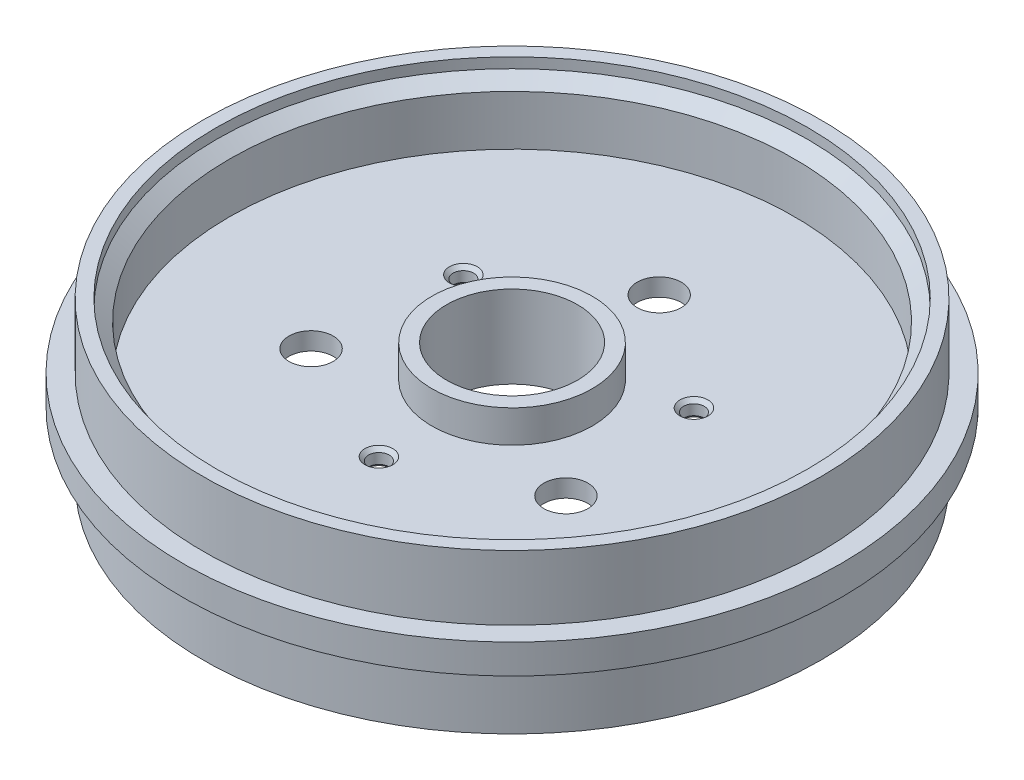
ISO-10303-21;
HEADER;
FILE_DESCRIPTION(('STEP AP214'),'2;1');
FILE_NAME('part.step','',(''),(''),'','','');
FILE_SCHEMA(('AUTOMOTIVE_DESIGN { 1 0 10303 214 1 1 1 1 }'));
ENDSEC;
DATA;
#1=APPLICATION_CONTEXT('core data for automotive mechanical design processes');
#2=APPLICATION_PROTOCOL_DEFINITION('international standard','automotive_design',2000,#1);
#3=PRODUCT_CONTEXT('',#1,'mechanical');
#4=PRODUCT('Part','Part','',(#3));
#5=PRODUCT_RELATED_PRODUCT_CATEGORY('part','',(#4));
#6=PRODUCT_DEFINITION_FORMATION('','',#4);
#7=PRODUCT_DEFINITION_CONTEXT('part definition',#1,'design');
#8=PRODUCT_DEFINITION('design','',#6,#7);
#9=PRODUCT_DEFINITION_SHAPE('','',#8);
#10=(LENGTH_UNIT() NAMED_UNIT(*) SI_UNIT(.MILLI.,.METRE.));
#11=(NAMED_UNIT(*) PLANE_ANGLE_UNIT() SI_UNIT($,.RADIAN.));
#12=(NAMED_UNIT(*) SI_UNIT($,.STERADIAN.) SOLID_ANGLE_UNIT());
#13=UNCERTAINTY_MEASURE_WITH_UNIT(LENGTH_MEASURE(1.E-05),#10,'distance_accuracy_value','');
#14=(GEOMETRIC_REPRESENTATION_CONTEXT(3) GLOBAL_UNCERTAINTY_ASSIGNED_CONTEXT((#13)) GLOBAL_UNIT_ASSIGNED_CONTEXT((#10,
#11,#12)) REPRESENTATION_CONTEXT('',''));
#15=CARTESIAN_POINT('',(0.,0.,0.));
#16=DIRECTION('',(0.,0.,1.));
#17=DIRECTION('',(1.,0.,0.));
#18=AXIS2_PLACEMENT_3D('',#15,#16,#17);
#19=CARTESIAN_POINT('',(0.,-5.4,0.));
#20=DIRECTION('',(0.,-1.,0.));
#21=DIRECTION('',(1.,0.,0.));
#22=AXIS2_PLACEMENT_3D('',#19,#20,#21);
#23=CYLINDRICAL_SURFACE('',#22,4.45);
#24=CARTESIAN_POINT('',(0.,2.8,0.));
#25=DIRECTION('',(0.,-1.,0.));
#26=DIRECTION('',(1.,0.,0.));
#27=AXIS2_PLACEMENT_3D('',#24,#25,#26);
#28=CIRCLE('',#27,4.45);
#29=CARTESIAN_POINT('',(4.45,2.8,0.));
#30=VERTEX_POINT('',#29);
#31=EDGE_CURVE('E10',#30,#30,#28,.T.);
#32=ORIENTED_EDGE('',*,*,#31,.F.);
#33=EDGE_LOOP('',(#32));
#34=FACE_BOUND('',#33,.T.);
#35=CARTESIAN_POINT('',(0.,-2.8,0.));
#36=DIRECTION('',(0.,-1.,0.));
#37=DIRECTION('',(1.,0.,0.));
#38=AXIS2_PLACEMENT_3D('',#35,#36,#37);
#39=CIRCLE('',#38,4.45);
#40=CARTESIAN_POINT('',(4.45,-2.8,0.));
#41=VERTEX_POINT('',#40);
#42=EDGE_CURVE('E125',#41,#41,#39,.T.);
#43=ORIENTED_EDGE('',*,*,#42,.T.);
#44=EDGE_LOOP('',(#43));
#45=FACE_BOUND('',#44,.T.);
#46=ADVANCED_FACE('F34',(#34,#45),#23,.F.);
#47=CARTESIAN_POINT('',(4.45,2.8,0.));
#48=DIRECTION('',(0.,1.,0.));
#49=DIRECTION('',(-1.,0.,0.));
#50=AXIS2_PLACEMENT_3D('',#47,#48,#49);
#51=PLANE('',#50);
#52=ORIENTED_EDGE('',*,*,#31,.T.);
#53=EDGE_LOOP('',(#52));
#54=FACE_BOUND('',#53,.T.);
#55=CARTESIAN_POINT('',(0.,2.8,0.));
#56=DIRECTION('',(0.,-1.,0.));
#57=DIRECTION('',(1.,0.,0.));
#58=AXIS2_PLACEMENT_3D('',#55,#56,#57);
#59=CIRCLE('',#58,5.45);
#60=CARTESIAN_POINT('',(5.45,2.8,0.));
#61=VERTEX_POINT('',#60);
#62=EDGE_CURVE('E41',#61,#61,#59,.T.);
#63=ORIENTED_EDGE('',*,*,#62,.F.);
#64=EDGE_LOOP('',(#63));
#65=FACE_BOUND('',#64,.T.);
#66=ADVANCED_FACE('F156',(#54,#65),#51,.T.);
#67=CARTESIAN_POINT('',(0.,-5.4,0.));
#68=DIRECTION('',(0.,-1.,0.));
#69=DIRECTION('',(1.,0.,0.));
#70=AXIS2_PLACEMENT_3D('',#67,#68,#69);
#71=CYLINDRICAL_SURFACE('',#70,5.45);
#72=ORIENTED_EDGE('',*,*,#62,.T.);
#73=EDGE_LOOP('',(#72));
#74=FACE_BOUND('',#73,.T.);
#75=CARTESIAN_POINT('',(0.,0.6,0.));
#76=DIRECTION('',(0.,-1.,0.));
#77=DIRECTION('',(1.,0.,0.));
#78=AXIS2_PLACEMENT_3D('',#75,#76,#77);
#79=CIRCLE('',#78,5.45);
#80=CARTESIAN_POINT('',(5.45,0.600000000000001,0.));
#81=VERTEX_POINT('',#80);
#82=EDGE_CURVE('E46',#81,#81,#79,.T.);
#83=ORIENTED_EDGE('',*,*,#82,.F.);
#84=EDGE_LOOP('',(#83));
#85=FACE_BOUND('',#84,.T.);
#86=ADVANCED_FACE('F154',(#74,#85),#71,.T.);
#87=CARTESIAN_POINT('',(5.45,0.599999999999999,0.));
#88=DIRECTION('',(0.,1.,0.));
#89=DIRECTION('',(-1.,0.,0.));
#90=AXIS2_PLACEMENT_3D('',#87,#88,#89);
#91=PLANE('',#90);
#92=CARTESIAN_POINT('',(0.,0.599999999999998,9.05));
#93=DIRECTION('',(0.,1.,0.));
#94=DIRECTION('',(-1.,0.,0.));
#95=AXIS2_PLACEMENT_3D('',#92,#93,#94);
#96=CIRCLE('',#95,0.95);
#97=CARTESIAN_POINT('',(-0.95,0.599999999999998,9.05));
#98=VERTEX_POINT('',#97);
#99=EDGE_CURVE('E54',#98,#98,#96,.T.);
#100=ORIENTED_EDGE('',*,*,#99,.F.);
#101=EDGE_LOOP('',(#100));
#102=FACE_BOUND('',#101,.T.);
#103=CARTESIAN_POINT('',(7.83752990424918,0.6,-4.525));
#104=DIRECTION('',(0.,1.,0.));
#105=DIRECTION('',(-1.,0.,0.));
#106=AXIS2_PLACEMENT_3D('',#103,#104,#105);
#107=CIRCLE('',#106,0.949999999999999);
#108=CARTESIAN_POINT('',(6.88752990424918,0.6,-4.525));
#109=VERTEX_POINT('',#108);
#110=EDGE_CURVE('E73',#109,#109,#107,.T.);
#111=ORIENTED_EDGE('',*,*,#110,.F.);
#112=EDGE_LOOP('',(#111));
#113=FACE_BOUND('',#112,.T.);
#114=CARTESIAN_POINT('',(-7.83752990424917,0.599999999999997,-4.525));
#115=DIRECTION('',(0.,1.,0.));
#116=DIRECTION('',(-1.,0.,0.));
#117=AXIS2_PLACEMENT_3D('',#114,#115,#116);
#118=CIRCLE('',#117,0.95);
#119=CARTESIAN_POINT('',(-8.78752990424917,0.599999999999997,-4.525));
#120=VERTEX_POINT('',#119);
#121=EDGE_CURVE('E69',#120,#120,#118,.T.);
#122=ORIENTED_EDGE('',*,*,#121,.F.);
#123=EDGE_LOOP('',(#122));
#124=FACE_BOUND('',#123,.T.);
#125=CARTESIAN_POINT('',(0.,0.599999999999998,-10.));
#126=DIRECTION('',(0.,1.,0.));
#127=DIRECTION('',(-1.,0.,0.));
#128=AXIS2_PLACEMENT_3D('',#125,#126,#127);
#129=CIRCLE('',#128,1.5);
#130=CARTESIAN_POINT('',(-1.5,0.599999999999998,-10.));
#131=VERTEX_POINT('',#130);
#132=EDGE_CURVE('E81',#131,#131,#129,.T.);
#133=ORIENTED_EDGE('',*,*,#132,.F.);
#134=EDGE_LOOP('',(#133));
#135=FACE_BOUND('',#134,.T.);
#136=CARTESIAN_POINT('',(8.66025403784439,0.6,5.));
#137=DIRECTION('',(0.,1.,0.));
#138=DIRECTION('',(-1.,0.,0.));
#139=AXIS2_PLACEMENT_3D('',#136,#137,#138);
#140=CIRCLE('',#139,1.5);
#141=CARTESIAN_POINT('',(7.16025403784439,0.6,5.));
#142=VERTEX_POINT('',#141);
#143=EDGE_CURVE('E60',#142,#142,#140,.T.);
#144=ORIENTED_EDGE('',*,*,#143,.F.);
#145=EDGE_LOOP('',(#144));
#146=FACE_BOUND('',#145,.T.);
#147=CARTESIAN_POINT('',(-8.66025403784439,0.599999999999997,5.00000000000001));
#148=DIRECTION('',(0.,1.,0.));
#149=DIRECTION('',(-1.,0.,0.));
#150=AXIS2_PLACEMENT_3D('',#147,#148,#149);
#151=CIRCLE('',#150,1.5);
#152=CARTESIAN_POINT('',(-10.1602540378444,0.599999999999996,5.00000000000001));
#153=VERTEX_POINT('',#152);
#154=EDGE_CURVE('E88',#153,#153,#151,.T.);
#155=ORIENTED_EDGE('',*,*,#154,.F.);
#156=EDGE_LOOP('',(#155));
#157=FACE_BOUND('',#156,.T.);
#158=ORIENTED_EDGE('',*,*,#82,.T.);
#159=EDGE_LOOP('',(#158));
#160=FACE_BOUND('',#159,.T.);
#161=CARTESIAN_POINT('',(0.,0.599999999999997,0.));
#162=DIRECTION('',(0.,-1.,0.));
#163=DIRECTION('',(1.,0.,0.));
#164=AXIS2_PLACEMENT_3D('',#161,#162,#163);
#165=CIRCLE('',#164,19.2);
#166=CARTESIAN_POINT('',(19.2,0.600000000000001,0.));
#167=VERTEX_POINT('',#166);
#168=EDGE_CURVE('E146',#167,#167,#165,.T.);
#169=ORIENTED_EDGE('',*,*,#168,.F.);
#170=EDGE_LOOP('',(#169));
#171=FACE_BOUND('',#170,.T.);
#172=ADVANCED_FACE('F151',(#102,#113,#124,#135,#146,#157,#160,#171),#91,.T.);
#173=CARTESIAN_POINT('',(0.,-5.4,0.));
#174=DIRECTION('',(0.,-1.,0.));
#175=DIRECTION('',(1.,0.,0.));
#176=AXIS2_PLACEMENT_3D('',#173,#174,#175);
#177=CYLINDRICAL_SURFACE('',#176,19.2);
#178=ORIENTED_EDGE('',*,*,#168,.T.);
#179=EDGE_LOOP('',(#178));
#180=FACE_BOUND('',#179,.T.);
#181=CARTESIAN_POINT('',(0.,3.99999999999999,0.));
#182=DIRECTION('',(0.,-1.,0.));
#183=DIRECTION('',(1.,0.,0.));
#184=AXIS2_PLACEMENT_3D('',#181,#182,#183);
#185=CIRCLE('',#184,19.2);
#186=CARTESIAN_POINT('',(19.2,4.,0.));
#187=VERTEX_POINT('',#186);
#188=EDGE_CURVE('E143',#187,#187,#185,.T.);
#189=ORIENTED_EDGE('',*,*,#188,.F.);
#190=EDGE_LOOP('',(#189));
#191=FACE_BOUND('',#190,.T.);
#192=ADVANCED_FACE('F163',(#180,#191),#177,.F.);
#193=CARTESIAN_POINT('',(0.,4.7,0.));
#194=DIRECTION('',(0.,1.,0.));
#195=DIRECTION('',(-1.,0.,0.));
#196=AXIS2_PLACEMENT_3D('',#193,#194,#195);
#197=CONICAL_SURFACE('',#196,20.1,0.90975315794421);
#198=ORIENTED_EDGE('',*,*,#188,.T.);
#199=EDGE_LOOP('',(#198));
#200=FACE_BOUND('',#199,.T.);
#201=CARTESIAN_POINT('',(0.,4.7,0.));
#202=DIRECTION('',(0.,-1.,0.));
#203=DIRECTION('',(1.,0.,0.));
#204=AXIS2_PLACEMENT_3D('',#201,#202,#203);
#205=CIRCLE('',#204,20.1);
#206=CARTESIAN_POINT('',(20.1,4.7,0.));
#207=VERTEX_POINT('',#206);
#208=EDGE_CURVE('E140',#207,#207,#205,.T.);
#209=ORIENTED_EDGE('',*,*,#208,.F.);
#210=EDGE_LOOP('',(#209));
#211=FACE_BOUND('',#210,.T.);
#212=ADVANCED_FACE('F251',(#200,#211),#197,.F.);
#213=CARTESIAN_POINT('',(0.,-5.4,0.));
#214=DIRECTION('',(0.,-1.,0.));
#215=DIRECTION('',(1.,0.,0.));
#216=AXIS2_PLACEMENT_3D('',#213,#214,#215);
#217=CYLINDRICAL_SURFACE('',#216,20.1);
#218=ORIENTED_EDGE('',*,*,#208,.T.);
#219=EDGE_LOOP('',(#218));
#220=FACE_BOUND('',#219,.T.);
#221=CARTESIAN_POINT('',(0.,5.4,0.));
#222=DIRECTION('',(0.,-1.,0.));
#223=DIRECTION('',(1.,0.,0.));
#224=AXIS2_PLACEMENT_3D('',#221,#222,#223);
#225=CIRCLE('',#224,20.1);
#226=CARTESIAN_POINT('',(20.1,5.4,0.));
#227=VERTEX_POINT('',#226);
#228=EDGE_CURVE('E137',#227,#227,#225,.T.);
#229=ORIENTED_EDGE('',*,*,#228,.F.);
#230=EDGE_LOOP('',(#229));
#231=FACE_BOUND('',#230,.T.);
#232=ADVANCED_FACE('F247',(#220,#231),#217,.F.);
#233=CARTESIAN_POINT('',(20.1,5.4,0.));
#234=DIRECTION('',(0.,1.,0.));
#235=DIRECTION('',(-1.,0.,0.));
#236=AXIS2_PLACEMENT_3D('',#233,#234,#235);
#237=PLANE('',#236);
#238=ORIENTED_EDGE('',*,*,#228,.T.);
#239=EDGE_LOOP('',(#238));
#240=FACE_BOUND('',#239,.T.);
#241=CARTESIAN_POINT('',(0.,5.4,0.));
#242=DIRECTION('',(0.,-1.,0.));
#243=DIRECTION('',(1.,0.,0.));
#244=AXIS2_PLACEMENT_3D('',#241,#242,#243);
#245=CIRCLE('',#244,21.);
#246=CARTESIAN_POINT('',(21.,5.4,0.));
#247=VERTEX_POINT('',#246);
#248=EDGE_CURVE('E134',#247,#247,#245,.T.);
#249=ORIENTED_EDGE('',*,*,#248,.F.);
#250=EDGE_LOOP('',(#249));
#251=FACE_BOUND('',#250,.T.);
#252=ADVANCED_FACE('F243',(#240,#251),#237,.T.);
#253=CARTESIAN_POINT('',(0.,-5.4,0.));
#254=DIRECTION('',(0.,-1.,0.));
#255=DIRECTION('',(1.,0.,0.));
#256=AXIS2_PLACEMENT_3D('',#253,#254,#255);
#257=CYLINDRICAL_SURFACE('',#256,21.);
#258=ORIENTED_EDGE('',*,*,#248,.T.);
#259=EDGE_LOOP('',(#258));
#260=FACE_BOUND('',#259,.T.);
#261=CARTESIAN_POINT('',(0.,0.999999999999997,0.));
#262=DIRECTION('',(0.,-1.,0.));
#263=DIRECTION('',(1.,0.,0.));
#264=AXIS2_PLACEMENT_3D('',#261,#262,#263);
#265=CIRCLE('',#264,21.);
#266=CARTESIAN_POINT('',(21.,1.,0.));
#267=VERTEX_POINT('',#266);
#268=EDGE_CURVE('E131',#267,#267,#265,.T.);
#269=ORIENTED_EDGE('',*,*,#268,.F.);
#270=EDGE_LOOP('',(#269));
#271=FACE_BOUND('',#270,.T.);
#272=ADVANCED_FACE('F237',(#260,#271),#257,.T.);
#273=CARTESIAN_POINT('',(21.,1.,0.));
#274=DIRECTION('',(0.,1.,0.));
#275=DIRECTION('',(-1.,0.,0.));
#276=AXIS2_PLACEMENT_3D('',#273,#274,#275);
#277=PLANE('',#276);
#278=ORIENTED_EDGE('',*,*,#268,.T.);
#279=EDGE_LOOP('',(#278));
#280=FACE_BOUND('',#279,.T.);
#281=CARTESIAN_POINT('',(0.,0.999999999999996,0.));
#282=DIRECTION('',(0.,-1.,0.));
#283=DIRECTION('',(1.,0.,0.));
#284=AXIS2_PLACEMENT_3D('',#281,#282,#283);
#285=CIRCLE('',#284,22.4);
#286=CARTESIAN_POINT('',(22.4,1.,0.));
#287=VERTEX_POINT('',#286);
#288=EDGE_CURVE('E128',#287,#287,#285,.T.);
#289=ORIENTED_EDGE('',*,*,#288,.F.);
#290=EDGE_LOOP('',(#289));
#291=FACE_BOUND('',#290,.T.);
#292=ADVANCED_FACE('F231',(#280,#291),#277,.T.);
#293=CARTESIAN_POINT('',(0.,-5.4,0.));
#294=DIRECTION('',(0.,-1.,0.));
#295=DIRECTION('',(1.,0.,0.));
#296=AXIS2_PLACEMENT_3D('',#293,#294,#295);
#297=CYLINDRICAL_SURFACE('',#296,22.4);
#298=ORIENTED_EDGE('',*,*,#288,.T.);
#299=EDGE_LOOP('',(#298));
#300=FACE_BOUND('',#299,.T.);
#301=CARTESIAN_POINT('',(0.,-0.999999999999996,0.));
#302=DIRECTION('',(0.,-1.,0.));
#303=DIRECTION('',(1.,0.,0.));
#304=AXIS2_PLACEMENT_3D('',#301,#302,#303);
#305=CIRCLE('',#304,22.4);
#306=CARTESIAN_POINT('',(22.4,-0.999999999999992,0.));
#307=VERTEX_POINT('',#306);
#308=EDGE_CURVE('E98',#307,#307,#305,.T.);
#309=ORIENTED_EDGE('',*,*,#308,.F.);
#310=EDGE_LOOP('',(#309));
#311=FACE_BOUND('',#310,.T.);
#312=ADVANCED_FACE('F177',(#300,#311),#297,.T.);
#313=CARTESIAN_POINT('',(4.45,-2.8,0.));
#314=DIRECTION('',(0.,-1.,0.));
#315=DIRECTION('',(-1.,0.,0.));
#316=AXIS2_PLACEMENT_3D('',#313,#314,#315);
#317=PLANE('',#316);
#318=ORIENTED_EDGE('',*,*,#42,.F.);
#319=EDGE_LOOP('',(#318));
#320=FACE_BOUND('',#319,.T.);
#321=CARTESIAN_POINT('',(0.,-2.8,0.));
#322=DIRECTION('',(0.,-1.,0.));
#323=DIRECTION('',(1.,0.,0.));
#324=AXIS2_PLACEMENT_3D('',#321,#322,#323);
#325=CIRCLE('',#324,5.45);
#326=CARTESIAN_POINT('',(5.45,-2.8,0.));
#327=VERTEX_POINT('',#326);
#328=EDGE_CURVE('E122',#327,#327,#325,.T.);
#329=ORIENTED_EDGE('',*,*,#328,.T.);
#330=EDGE_LOOP('',(#329));
#331=FACE_BOUND('',#330,.T.);
#332=ADVANCED_FACE('F173',(#320,#331),#317,.T.);
#333=CARTESIAN_POINT('',(0.,5.4,0.));
#334=DIRECTION('',(0.,1.,0.));
#335=DIRECTION('',(1.,0.,0.));
#336=AXIS2_PLACEMENT_3D('',#333,#334,#335);
#337=CYLINDRICAL_SURFACE('',#336,5.45);
#338=ORIENTED_EDGE('',*,*,#328,.F.);
#339=EDGE_LOOP('',(#338));
#340=FACE_BOUND('',#339,.T.);
#341=CARTESIAN_POINT('',(0.,-0.6,0.));
#342=DIRECTION('',(0.,-1.,0.));
#343=DIRECTION('',(1.,0.,0.));
#344=AXIS2_PLACEMENT_3D('',#341,#342,#343);
#345=CIRCLE('',#344,5.45);
#346=CARTESIAN_POINT('',(5.45,-0.599999999999999,0.));
#347=VERTEX_POINT('',#346);
#348=EDGE_CURVE('E119',#347,#347,#345,.T.);
#349=ORIENTED_EDGE('',*,*,#348,.T.);
#350=EDGE_LOOP('',(#349));
#351=FACE_BOUND('',#350,.T.);
#352=ADVANCED_FACE('F176',(#340,#351),#337,.T.);
#353=CARTESIAN_POINT('',(5.45,-0.599999999999997,0.));
#354=DIRECTION('',(0.,-1.,0.));
#355=DIRECTION('',(-1.,0.,0.));
#356=AXIS2_PLACEMENT_3D('',#353,#354,#355);
#357=PLANE('',#356);
#358=CARTESIAN_POINT('',(7.83752990424918,-0.599999999999997,-4.525));
#359=DIRECTION('',(0.,-1.,0.));
#360=DIRECTION('',(1.,0.,0.));
#361=AXIS2_PLACEMENT_3D('',#358,#359,#360);
#362=CIRCLE('',#361,0.949999999999999);
#363=CARTESIAN_POINT('',(8.78752990424918,-0.599999999999997,-4.525));
#364=VERTEX_POINT('',#363);
#365=EDGE_CURVE('E64',#364,#364,#362,.T.);
#366=ORIENTED_EDGE('',*,*,#365,.F.);
#367=EDGE_LOOP('',(#366));
#368=FACE_BOUND('',#367,.T.);
#369=CARTESIAN_POINT('',(0.,-0.599999999999998,9.05));
#370=DIRECTION('',(0.,-1.,0.));
#371=DIRECTION('',(1.,0.,0.));
#372=AXIS2_PLACEMENT_3D('',#369,#370,#371);
#373=CIRCLE('',#372,0.949999999999999);
#374=CARTESIAN_POINT('',(0.95,-0.599999999999998,9.05));
#375=VERTEX_POINT('',#374);
#376=EDGE_CURVE('E487',#375,#375,#373,.T.);
#377=ORIENTED_EDGE('',*,*,#376,.F.);
#378=EDGE_LOOP('',(#377));
#379=FACE_BOUND('',#378,.T.);
#380=CARTESIAN_POINT('',(-7.83752990424917,-0.6,-4.525));
#381=DIRECTION('',(0.,-1.,0.));
#382=DIRECTION('',(1.,0.,0.));
#383=AXIS2_PLACEMENT_3D('',#380,#381,#382);
#384=CIRCLE('',#383,0.949999999999999);
#385=CARTESIAN_POINT('',(-6.88752990424917,-0.6,-4.525));
#386=VERTEX_POINT('',#385);
#387=EDGE_CURVE('E490',#386,#386,#384,.T.);
#388=ORIENTED_EDGE('',*,*,#387,.F.);
#389=EDGE_LOOP('',(#388));
#390=FACE_BOUND('',#389,.T.);
#391=CARTESIAN_POINT('',(0.,-0.599999999999998,-10.));
#392=DIRECTION('',(0.,-1.,0.));
#393=DIRECTION('',(1.,0.,0.));
#394=AXIS2_PLACEMENT_3D('',#391,#392,#393);
#395=CIRCLE('',#394,1.5);
#396=CARTESIAN_POINT('',(1.5,-0.599999999999998,-10.));
#397=VERTEX_POINT('',#396);
#398=EDGE_CURVE('E84',#397,#397,#395,.F.);
#399=ORIENTED_EDGE('',*,*,#398,.T.);
#400=EDGE_LOOP('',(#399));
#401=FACE_BOUND('',#400,.T.);
#402=CARTESIAN_POINT('',(8.66025403784439,-0.599999999999996,5.));
#403=DIRECTION('',(0.,-1.,0.));
#404=DIRECTION('',(1.,0.,0.));
#405=AXIS2_PLACEMENT_3D('',#402,#403,#404);
#406=CIRCLE('',#405,1.5);
#407=CARTESIAN_POINT('',(10.1602540378444,-0.599999999999996,5.));
#408=VERTEX_POINT('',#407);
#409=EDGE_CURVE('E85',#408,#408,#406,.F.);
#410=ORIENTED_EDGE('',*,*,#409,.T.);
#411=EDGE_LOOP('',(#410));
#412=FACE_BOUND('',#411,.T.);
#413=CARTESIAN_POINT('',(-8.66025403784439,-0.6,5.00000000000001));
#414=DIRECTION('',(0.,-1.,0.));
#415=DIRECTION('',(1.,0.,0.));
#416=AXIS2_PLACEMENT_3D('',#413,#414,#415);
#417=CIRCLE('',#416,1.5);
#418=CARTESIAN_POINT('',(-7.16025403784439,-0.6,5.00000000000001));
#419=VERTEX_POINT('',#418);
#420=EDGE_CURVE('E95',#419,#419,#417,.F.);
#421=ORIENTED_EDGE('',*,*,#420,.T.);
#422=EDGE_LOOP('',(#421));
#423=FACE_BOUND('',#422,.T.);
#424=ORIENTED_EDGE('',*,*,#348,.F.);
#425=EDGE_LOOP('',(#424));
#426=FACE_BOUND('',#425,.T.);
#427=CARTESIAN_POINT('',(0.,-0.599999999999997,0.));
#428=DIRECTION('',(0.,-1.,0.));
#429=DIRECTION('',(1.,0.,0.));
#430=AXIS2_PLACEMENT_3D('',#427,#428,#429);
#431=CIRCLE('',#430,19.2);
#432=CARTESIAN_POINT('',(19.2,-0.599999999999994,0.));
#433=VERTEX_POINT('',#432);
#434=EDGE_CURVE('E116',#433,#433,#431,.T.);
#435=ORIENTED_EDGE('',*,*,#434,.T.);
#436=EDGE_LOOP('',(#435));
#437=FACE_BOUND('',#436,.T.);
#438=ADVANCED_FACE('F183',(#368,#379,#390,#401,#412,#423,#426,#437),#357,.T.);
#439=CARTESIAN_POINT('',(0.,5.4,0.));
#440=DIRECTION('',(0.,1.,0.));
#441=DIRECTION('',(1.,0.,0.));
#442=AXIS2_PLACEMENT_3D('',#439,#440,#441);
#443=CYLINDRICAL_SURFACE('',#442,19.2);
#444=ORIENTED_EDGE('',*,*,#434,.F.);
#445=EDGE_LOOP('',(#444));
#446=FACE_BOUND('',#445,.T.);
#447=CARTESIAN_POINT('',(0.,-3.99999999999999,0.));
#448=DIRECTION('',(0.,-1.,0.));
#449=DIRECTION('',(1.,0.,0.));
#450=AXIS2_PLACEMENT_3D('',#447,#448,#449);
#451=CIRCLE('',#450,19.2);
#452=CARTESIAN_POINT('',(19.2,-3.99999999999999,0.));
#453=VERTEX_POINT('',#452);
#454=EDGE_CURVE('E113',#453,#453,#451,.T.);
#455=ORIENTED_EDGE('',*,*,#454,.T.);
#456=EDGE_LOOP('',(#455));
#457=FACE_BOUND('',#456,.T.);
#458=ADVANCED_FACE('F189',(#446,#457),#443,.F.);
#459=CARTESIAN_POINT('',(0.,-4.7,0.));
#460=DIRECTION('',(0.,-1.,0.));
#461=DIRECTION('',(-1.,0.,0.));
#462=AXIS2_PLACEMENT_3D('',#459,#460,#461);
#463=CONICAL_SURFACE('',#462,20.1,0.90975315794421);
#464=ORIENTED_EDGE('',*,*,#454,.F.);
#465=EDGE_LOOP('',(#464));
#466=FACE_BOUND('',#465,.T.);
#467=CARTESIAN_POINT('',(0.,-4.7,0.));
#468=DIRECTION('',(0.,-1.,0.));
#469=DIRECTION('',(1.,0.,0.));
#470=AXIS2_PLACEMENT_3D('',#467,#468,#469);
#471=CIRCLE('',#470,20.1);
#472=CARTESIAN_POINT('',(20.1,-4.69999999999999,0.));
#473=VERTEX_POINT('',#472);
#474=EDGE_CURVE('E110',#473,#473,#471,.T.);
#475=ORIENTED_EDGE('',*,*,#474,.T.);
#476=EDGE_LOOP('',(#475));
#477=FACE_BOUND('',#476,.T.);
#478=ADVANCED_FACE('F196',(#466,#477),#463,.F.);
#479=CARTESIAN_POINT('',(0.,5.4,0.));
#480=DIRECTION('',(0.,1.,0.));
#481=DIRECTION('',(1.,0.,0.));
#482=AXIS2_PLACEMENT_3D('',#479,#480,#481);
#483=CYLINDRICAL_SURFACE('',#482,20.1);
#484=ORIENTED_EDGE('',*,*,#474,.F.);
#485=EDGE_LOOP('',(#484));
#486=FACE_BOUND('',#485,.T.);
#487=CARTESIAN_POINT('',(0.,-5.4,0.));
#488=DIRECTION('',(0.,-1.,0.));
#489=DIRECTION('',(1.,0.,0.));
#490=AXIS2_PLACEMENT_3D('',#487,#488,#489);
#491=CIRCLE('',#490,20.1);
#492=CARTESIAN_POINT('',(20.1,-5.39999999999999,0.));
#493=VERTEX_POINT('',#492);
#494=EDGE_CURVE('E107',#493,#493,#491,.T.);
#495=ORIENTED_EDGE('',*,*,#494,.T.);
#496=EDGE_LOOP('',(#495));
#497=FACE_BOUND('',#496,.T.);
#498=ADVANCED_FACE('F202',(#486,#497),#483,.F.);
#499=CARTESIAN_POINT('',(20.1,-5.39999999999999,0.));
#500=DIRECTION('',(0.,-1.,0.));
#501=DIRECTION('',(-1.,0.,0.));
#502=AXIS2_PLACEMENT_3D('',#499,#500,#501);
#503=PLANE('',#502);
#504=ORIENTED_EDGE('',*,*,#494,.F.);
#505=EDGE_LOOP('',(#504));
#506=FACE_BOUND('',#505,.T.);
#507=CARTESIAN_POINT('',(0.,-5.4,0.));
#508=DIRECTION('',(0.,-1.,0.));
#509=DIRECTION('',(1.,0.,0.));
#510=AXIS2_PLACEMENT_3D('',#507,#508,#509);
#511=CIRCLE('',#510,21.);
#512=CARTESIAN_POINT('',(21.,-5.39999999999999,0.));
#513=VERTEX_POINT('',#512);
#514=EDGE_CURVE('E104',#513,#513,#511,.T.);
#515=ORIENTED_EDGE('',*,*,#514,.T.);
#516=EDGE_LOOP('',(#515));
#517=FACE_BOUND('',#516,.T.);
#518=ADVANCED_FACE('F208',(#506,#517),#503,.T.);
#519=CARTESIAN_POINT('',(0.,5.4,0.));
#520=DIRECTION('',(0.,1.,0.));
#521=DIRECTION('',(1.,0.,0.));
#522=AXIS2_PLACEMENT_3D('',#519,#520,#521);
#523=CYLINDRICAL_SURFACE('',#522,21.);
#524=ORIENTED_EDGE('',*,*,#514,.F.);
#525=EDGE_LOOP('',(#524));
#526=FACE_BOUND('',#525,.T.);
#527=CARTESIAN_POINT('',(0.,-0.999999999999997,0.));
#528=DIRECTION('',(0.,-1.,0.));
#529=DIRECTION('',(1.,0.,0.));
#530=AXIS2_PLACEMENT_3D('',#527,#528,#529);
#531=CIRCLE('',#530,21.);
#532=CARTESIAN_POINT('',(21.,-0.999999999999993,0.));
#533=VERTEX_POINT('',#532);
#534=EDGE_CURVE('E101',#533,#533,#531,.T.);
#535=ORIENTED_EDGE('',*,*,#534,.T.);
#536=EDGE_LOOP('',(#535));
#537=FACE_BOUND('',#536,.T.);
#538=ADVANCED_FACE('F214',(#526,#537),#523,.T.);
#539=CARTESIAN_POINT('',(21.,-0.999999999999992,0.));
#540=DIRECTION('',(0.,-1.,0.));
#541=DIRECTION('',(-1.,0.,0.));
#542=AXIS2_PLACEMENT_3D('',#539,#540,#541);
#543=PLANE('',#542);
#544=ORIENTED_EDGE('',*,*,#534,.F.);
#545=EDGE_LOOP('',(#544));
#546=FACE_BOUND('',#545,.T.);
#547=ORIENTED_EDGE('',*,*,#308,.T.);
#548=EDGE_LOOP('',(#547));
#549=FACE_BOUND('',#548,.T.);
#550=ADVANCED_FACE('F220',(#546,#549),#543,.T.);
#551=CARTESIAN_POINT('',(-8.66025403784439,-4.84264068711929,5.00000000000001));
#552=DIRECTION('',(0.,1.,0.));
#553=DIRECTION('',(-1.,0.,0.));
#554=AXIS2_PLACEMENT_3D('',#551,#552,#553);
#555=CYLINDRICAL_SURFACE('',#554,1.5);
#556=ORIENTED_EDGE('',*,*,#154,.T.);
#557=EDGE_LOOP('',(#556));
#558=FACE_BOUND('',#557,.T.);
#559=ORIENTED_EDGE('',*,*,#420,.F.);
#560=EDGE_LOOP('',(#559));
#561=FACE_BOUND('',#560,.T.);
#562=ADVANCED_FACE('F226',(#558,#561),#555,.F.);
#563=CARTESIAN_POINT('',(7.83752990424918,-4.84264068711928,-4.525));
#564=DIRECTION('',(0.,1.,0.));
#565=DIRECTION('',(-1.,0.,0.));
#566=AXIS2_PLACEMENT_3D('',#563,#564,#565);
#567=CYLINDRICAL_SURFACE('',#566,0.700000000000001);
#568=CARTESIAN_POINT('',(7.83752990424918,-0.35,-4.525));
#569=DIRECTION('',(0.,-1.,0.));
#570=DIRECTION('',(1.,0.,0.));
#571=AXIS2_PLACEMENT_3D('',#568,#569,#570);
#572=CIRCLE('',#571,0.700000000000001);
#573=CARTESIAN_POINT('',(8.53752990424918,-0.35,-4.525));
#574=VERTEX_POINT('',#573);
#575=EDGE_CURVE('E37',#574,#574,#572,.T.);
#576=ORIENTED_EDGE('',*,*,#575,.T.);
#577=EDGE_LOOP('',(#576));
#578=FACE_BOUND('',#577,.T.);
#579=CARTESIAN_POINT('',(7.83752990424918,0.350000000000003,-4.525));
#580=DIRECTION('',(0.,1.,0.));
#581=DIRECTION('',(-1.,0.,0.));
#582=AXIS2_PLACEMENT_3D('',#579,#580,#581);
#583=CIRCLE('',#582,0.700000000000001);
#584=CARTESIAN_POINT('',(7.13752990424918,0.350000000000003,-4.525));
#585=VERTEX_POINT('',#584);
#586=EDGE_CURVE('E57',#585,#585,#583,.T.);
#587=ORIENTED_EDGE('',*,*,#586,.T.);
#588=EDGE_LOOP('',(#587));
#589=FACE_BOUND('',#588,.T.);
#590=ADVANCED_FACE('F363',(#578,#589),#567,.F.);
#591=CARTESIAN_POINT('',(-7.83752990424917,-4.84264068711929,-4.525));
#592=DIRECTION('',(0.,1.,0.));
#593=DIRECTION('',(-1.,0.,0.));
#594=AXIS2_PLACEMENT_3D('',#591,#592,#593);
#595=CYLINDRICAL_SURFACE('',#594,0.700000000000001);
#596=CARTESIAN_POINT('',(-7.83752990424917,-0.350000000000003,-4.525));
#597=DIRECTION('',(0.,-1.,0.));
#598=DIRECTION('',(1.,0.,0.));
#599=AXIS2_PLACEMENT_3D('',#596,#597,#598);
#600=CIRCLE('',#599,0.700000000000001);
#601=CARTESIAN_POINT('',(-7.13752990424917,-0.350000000000003,-4.525));
#602=VERTEX_POINT('',#601);
#603=EDGE_CURVE('E63',#602,#602,#600,.T.);
#604=ORIENTED_EDGE('',*,*,#603,.T.);
#605=EDGE_LOOP('',(#604));
#606=FACE_BOUND('',#605,.T.);
#607=CARTESIAN_POINT('',(-7.83752990424917,0.349999999999999,-4.525));
#608=DIRECTION('',(0.,1.,0.));
#609=DIRECTION('',(-1.,0.,0.));
#610=AXIS2_PLACEMENT_3D('',#607,#608,#609);
#611=CIRCLE('',#610,0.700000000000001);
#612=CARTESIAN_POINT('',(-8.53752990424917,0.349999999999999,-4.525));
#613=VERTEX_POINT('',#612);
#614=EDGE_CURVE('E53',#613,#613,#611,.T.);
#615=ORIENTED_EDGE('',*,*,#614,.T.);
#616=EDGE_LOOP('',(#615));
#617=FACE_BOUND('',#616,.T.);
#618=ADVANCED_FACE('F377',(#606,#617),#595,.F.);
#619=CARTESIAN_POINT('',(8.66025403784439,-4.84264068711928,5.));
#620=DIRECTION('',(0.,1.,0.));
#621=DIRECTION('',(-1.,0.,0.));
#622=AXIS2_PLACEMENT_3D('',#619,#620,#621);
#623=CYLINDRICAL_SURFACE('',#622,1.5);
#624=ORIENTED_EDGE('',*,*,#143,.T.);
#625=EDGE_LOOP('',(#624));
#626=FACE_BOUND('',#625,.T.);
#627=ORIENTED_EDGE('',*,*,#409,.F.);
#628=EDGE_LOOP('',(#627));
#629=FACE_BOUND('',#628,.T.);
#630=ADVANCED_FACE('F371',(#626,#629),#623,.F.);
#631=CARTESIAN_POINT('',(0.,-4.84264068711929,-10.));
#632=DIRECTION('',(0.,1.,0.));
#633=DIRECTION('',(-1.,0.,0.));
#634=AXIS2_PLACEMENT_3D('',#631,#632,#633);
#635=CYLINDRICAL_SURFACE('',#634,1.5);
#636=ORIENTED_EDGE('',*,*,#132,.T.);
#637=EDGE_LOOP('',(#636));
#638=FACE_BOUND('',#637,.T.);
#639=ORIENTED_EDGE('',*,*,#398,.F.);
#640=EDGE_LOOP('',(#639));
#641=FACE_BOUND('',#640,.T.);
#642=ADVANCED_FACE('F376',(#638,#641),#635,.F.);
#643=CARTESIAN_POINT('',(0.,-4.84264068711929,9.05));
#644=DIRECTION('',(0.,1.,0.));
#645=DIRECTION('',(-1.,0.,0.));
#646=AXIS2_PLACEMENT_3D('',#643,#644,#645);
#647=CYLINDRICAL_SURFACE('',#646,0.7);
#648=CARTESIAN_POINT('',(0.,-0.35,9.05));
#649=DIRECTION('',(0.,-1.,0.));
#650=DIRECTION('',(1.,0.,0.));
#651=AXIS2_PLACEMENT_3D('',#648,#649,#650);
#652=CIRCLE('',#651,0.7);
#653=CARTESIAN_POINT('',(0.7,-0.349999999999999,9.05));
#654=VERTEX_POINT('',#653);
#655=EDGE_CURVE('E61',#654,#654,#652,.T.);
#656=ORIENTED_EDGE('',*,*,#655,.T.);
#657=EDGE_LOOP('',(#656));
#658=FACE_BOUND('',#657,.T.);
#659=CARTESIAN_POINT('',(0.,0.349999999999999,9.05));
#660=DIRECTION('',(0.,1.,0.));
#661=DIRECTION('',(-1.,0.,0.));
#662=AXIS2_PLACEMENT_3D('',#659,#660,#661);
#663=CIRCLE('',#662,0.7);
#664=CARTESIAN_POINT('',(-0.7,0.349999999999999,9.05));
#665=VERTEX_POINT('',#664);
#666=EDGE_CURVE('E50',#665,#665,#663,.T.);
#667=ORIENTED_EDGE('',*,*,#666,.T.);
#668=EDGE_LOOP('',(#667));
#669=FACE_BOUND('',#668,.T.);
#670=ADVANCED_FACE('F388',(#658,#669),#647,.F.);
#671=CARTESIAN_POINT('',(0.,0.599999999999998,9.05));
#672=DIRECTION('',(0.,1.,0.));
#673=DIRECTION('',(-1.,0.,0.));
#674=AXIS2_PLACEMENT_3D('',#671,#672,#673);
#675=CONICAL_SURFACE('',#674,0.95,0.78539816339745);
#676=ORIENTED_EDGE('',*,*,#99,.T.);
#677=EDGE_LOOP('',(#676));
#678=FACE_BOUND('',#677,.T.);
#679=ORIENTED_EDGE('',*,*,#666,.F.);
#680=EDGE_LOOP('',(#679));
#681=FACE_BOUND('',#680,.T.);
#682=ADVANCED_FACE('F402',(#678,#681),#675,.F.);
#683=CARTESIAN_POINT('',(-7.83752990424917,0.599999999999997,-4.525));
#684=DIRECTION('',(0.,1.,0.));
#685=DIRECTION('',(-1.,0.,0.));
#686=AXIS2_PLACEMENT_3D('',#683,#684,#685);
#687=CONICAL_SURFACE('',#686,0.95,0.78539816339745);
#688=ORIENTED_EDGE('',*,*,#121,.T.);
#689=EDGE_LOOP('',(#688));
#690=FACE_BOUND('',#689,.T.);
#691=ORIENTED_EDGE('',*,*,#614,.F.);
#692=EDGE_LOOP('',(#691));
#693=FACE_BOUND('',#692,.T.);
#694=ADVANCED_FACE('F407',(#690,#693),#687,.F.);
#695=CARTESIAN_POINT('',(7.83752990424918,0.6,-4.525));
#696=DIRECTION('',(0.,1.,0.));
#697=DIRECTION('',(-1.,0.,0.));
#698=AXIS2_PLACEMENT_3D('',#695,#696,#697);
#699=CONICAL_SURFACE('',#698,0.949999999999999,0.78539816339745);
#700=ORIENTED_EDGE('',*,*,#110,.T.);
#701=EDGE_LOOP('',(#700));
#702=FACE_BOUND('',#701,.T.);
#703=ORIENTED_EDGE('',*,*,#586,.F.);
#704=EDGE_LOOP('',(#703));
#705=FACE_BOUND('',#704,.T.);
#706=ADVANCED_FACE('F417',(#702,#705),#699,.F.);
#707=CARTESIAN_POINT('',(0.,-0.599999999999998,9.05));
#708=DIRECTION('',(0.,-1.,0.));
#709=DIRECTION('',(1.,0.,0.));
#710=AXIS2_PLACEMENT_3D('',#707,#708,#709);
#711=CONICAL_SURFACE('',#710,0.949999999999999,0.78539816339745);
#712=ORIENTED_EDGE('',*,*,#376,.T.);
#713=EDGE_LOOP('',(#712));
#714=FACE_BOUND('',#713,.T.);
#715=ORIENTED_EDGE('',*,*,#655,.F.);
#716=EDGE_LOOP('',(#715));
#717=FACE_BOUND('',#716,.T.);
#718=ADVANCED_FACE('F426',(#714,#717),#711,.F.);
#719=CARTESIAN_POINT('',(-7.83752990424917,-0.6,-4.525));
#720=DIRECTION('',(0.,-1.,0.));
#721=DIRECTION('',(1.,0.,0.));
#722=AXIS2_PLACEMENT_3D('',#719,#720,#721);
#723=CONICAL_SURFACE('',#722,0.949999999999999,0.78539816339745);
#724=ORIENTED_EDGE('',*,*,#387,.T.);
#725=EDGE_LOOP('',(#724));
#726=FACE_BOUND('',#725,.T.);
#727=ORIENTED_EDGE('',*,*,#603,.F.);
#728=EDGE_LOOP('',(#727));
#729=FACE_BOUND('',#728,.T.);
#730=ADVANCED_FACE('F460',(#726,#729),#723,.F.);
#731=CARTESIAN_POINT('',(7.83752990424918,-0.599999999999997,-4.525));
#732=DIRECTION('',(0.,-1.,0.));
#733=DIRECTION('',(1.,0.,0.));
#734=AXIS2_PLACEMENT_3D('',#731,#732,#733);
#735=CONICAL_SURFACE('',#734,0.949999999999999,0.78539816339745);
#736=ORIENTED_EDGE('',*,*,#365,.T.);
#737=EDGE_LOOP('',(#736));
#738=FACE_BOUND('',#737,.T.);
#739=ORIENTED_EDGE('',*,*,#575,.F.);
#740=EDGE_LOOP('',(#739));
#741=FACE_BOUND('',#740,.T.);
#742=ADVANCED_FACE('F470',(#738,#741),#735,.F.);
#743=CLOSED_SHELL('',(#46,#66,#86,#172,#192,#212,#232,#252,#272,#292,#312,#332,#352,#438,#458,
#478,#498,#518,#538,#550,#562,#590,#618,#630,#642,#670,#682,#694,#706,#718,#730,#742));
#744=MANIFOLD_SOLID_BREP('B2',#743);
#745=ADVANCED_BREP_SHAPE_REPRESENTATION('',(#18,#744),#14);
#746=SHAPE_DEFINITION_REPRESENTATION(#9,#745);
ENDSEC;
END-ISO-10303-21;
